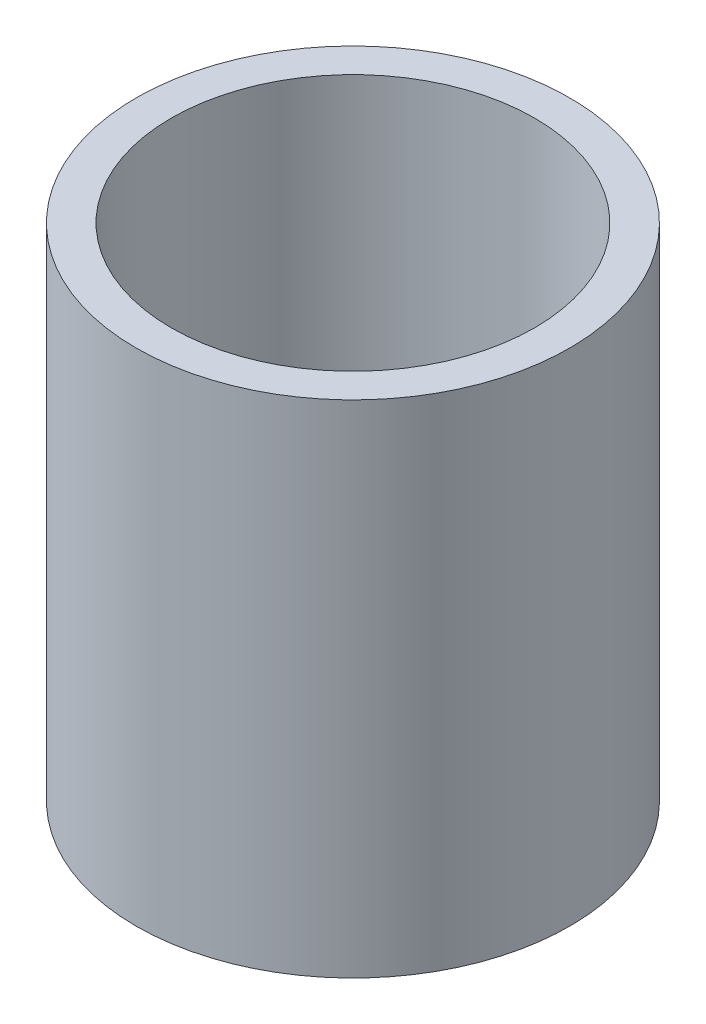
ISO-10303-21;
HEADER;
FILE_DESCRIPTION(('STEP AP214'),'2;1');
FILE_NAME('part.step','',(''),(''),'','','');
FILE_SCHEMA(('AUTOMOTIVE_DESIGN { 1 0 10303 214 1 1 1 1 }'));
ENDSEC;
DATA;
#1=APPLICATION_CONTEXT('core data for automotive mechanical design processes');
#2=APPLICATION_PROTOCOL_DEFINITION('international standard','automotive_design',2000,#1);
#3=PRODUCT_CONTEXT('',#1,'mechanical');
#4=PRODUCT('Part','Part','',(#3));
#5=PRODUCT_RELATED_PRODUCT_CATEGORY('part','',(#4));
#6=PRODUCT_DEFINITION_FORMATION('','',#4);
#7=PRODUCT_DEFINITION_CONTEXT('part definition',#1,'design');
#8=PRODUCT_DEFINITION('design','',#6,#7);
#9=PRODUCT_DEFINITION_SHAPE('','',#8);
#10=(LENGTH_UNIT() NAMED_UNIT(*) SI_UNIT(.MILLI.,.METRE.));
#11=(NAMED_UNIT(*) PLANE_ANGLE_UNIT() SI_UNIT($,.RADIAN.));
#12=(NAMED_UNIT(*) SI_UNIT($,.STERADIAN.) SOLID_ANGLE_UNIT());
#13=UNCERTAINTY_MEASURE_WITH_UNIT(LENGTH_MEASURE(1.E-05),#10,'distance_accuracy_value','');
#14=(GEOMETRIC_REPRESENTATION_CONTEXT(3) GLOBAL_UNCERTAINTY_ASSIGNED_CONTEXT((#13)) GLOBAL_UNIT_ASSIGNED_CONTEXT((#10,
#11,#12)) REPRESENTATION_CONTEXT('',''));
#15=CARTESIAN_POINT('',(0.,0.,0.));
#16=DIRECTION('',(0.,0.,1.));
#17=DIRECTION('',(1.,0.,0.));
#18=AXIS2_PLACEMENT_3D('',#15,#16,#17);
#19=CARTESIAN_POINT('',(0.,70.,0.));
#20=DIRECTION('',(0.,1.,0.));
#21=DIRECTION('',(0.,0.,1.));
#22=AXIS2_PLACEMENT_3D('',#19,#20,#21);
#23=PLANE('',#22);
#24=CARTESIAN_POINT('',(0.,70.,0.));
#25=DIRECTION('',(0.,1.,0.));
#26=DIRECTION('',(0.,0.,1.));
#27=AXIS2_PLACEMENT_3D('',#24,#25,#26);
#28=CIRCLE('',#27,30.3);
#29=CARTESIAN_POINT('',(0.,70.,30.3));
#30=VERTEX_POINT('',#29);
#31=EDGE_CURVE('E10',#30,#30,#28,.T.);
#32=ORIENTED_EDGE('',*,*,#31,.T.);
#33=EDGE_LOOP('',(#32));
#34=FACE_BOUND('',#33,.T.);
#35=CARTESIAN_POINT('',(0.,70.,0.));
#36=DIRECTION('',(0.,1.,0.));
#37=DIRECTION('',(0.,0.,1.));
#38=AXIS2_PLACEMENT_3D('',#35,#36,#37);
#39=CIRCLE('',#38,25.4);
#40=CARTESIAN_POINT('',(0.,70.,25.4));
#41=VERTEX_POINT('',#40);
#42=EDGE_CURVE('E54',#41,#41,#39,.T.);
#43=ORIENTED_EDGE('',*,*,#42,.F.);
#44=EDGE_LOOP('',(#43));
#45=FACE_BOUND('',#44,.T.);
#46=ADVANCED_FACE('F41',(#34,#45),#23,.T.);
#47=CARTESIAN_POINT('',(0.,0.,0.));
#48=DIRECTION('',(0.,1.,0.));
#49=DIRECTION('',(0.,0.,1.));
#50=AXIS2_PLACEMENT_3D('',#47,#48,#49);
#51=PLANE('',#50);
#52=CARTESIAN_POINT('',(0.,0.,0.));
#53=DIRECTION('',(0.,1.,0.));
#54=DIRECTION('',(0.,0.,1.));
#55=AXIS2_PLACEMENT_3D('',#52,#53,#54);
#56=CIRCLE('',#55,30.3);
#57=CARTESIAN_POINT('',(0.,0.,30.3));
#58=VERTEX_POINT('',#57);
#59=EDGE_CURVE('E45',#58,#58,#56,.T.);
#60=ORIENTED_EDGE('',*,*,#59,.F.);
#61=EDGE_LOOP('',(#60));
#62=FACE_BOUND('',#61,.T.);
#63=CARTESIAN_POINT('',(0.,0.,0.));
#64=DIRECTION('',(0.,1.,0.));
#65=DIRECTION('',(0.,0.,1.));
#66=AXIS2_PLACEMENT_3D('',#63,#64,#65);
#67=CIRCLE('',#66,25.4);
#68=CARTESIAN_POINT('',(0.,0.,25.4));
#69=VERTEX_POINT('',#68);
#70=EDGE_CURVE('E56',#69,#69,#67,.T.);
#71=ORIENTED_EDGE('',*,*,#70,.T.);
#72=EDGE_LOOP('',(#71));
#73=FACE_BOUND('',#72,.T.);
#74=ADVANCED_FACE('F68',(#62,#73),#51,.F.);
#75=CARTESIAN_POINT('',(0.,70.,0.));
#76=DIRECTION('',(0.,-1.,0.));
#77=DIRECTION('',(0.,0.,-1.));
#78=AXIS2_PLACEMENT_3D('',#75,#76,#77);
#79=CYLINDRICAL_SURFACE('',#78,30.3);
#80=ORIENTED_EDGE('',*,*,#31,.F.);
#81=EDGE_LOOP('',(#80));
#82=FACE_BOUND('',#81,.T.);
#83=ORIENTED_EDGE('',*,*,#59,.T.);
#84=EDGE_LOOP('',(#83));
#85=FACE_BOUND('',#84,.T.);
#86=ADVANCED_FACE('F43',(#82,#85),#79,.T.);
#87=CARTESIAN_POINT('',(0.,70.,0.));
#88=DIRECTION('',(0.,-1.,0.));
#89=DIRECTION('',(0.,0.,-1.));
#90=AXIS2_PLACEMENT_3D('',#87,#88,#89);
#91=CYLINDRICAL_SURFACE('',#90,25.4);
#92=ORIENTED_EDGE('',*,*,#42,.T.);
#93=EDGE_LOOP('',(#92));
#94=FACE_BOUND('',#93,.T.);
#95=ORIENTED_EDGE('',*,*,#70,.F.);
#96=EDGE_LOOP('',(#95));
#97=FACE_BOUND('',#96,.T.);
#98=ADVANCED_FACE('F64',(#94,#97),#91,.F.);
#99=CLOSED_SHELL('',(#46,#74,#86,#98));
#100=MANIFOLD_SOLID_BREP('B2',#99);
#101=ADVANCED_BREP_SHAPE_REPRESENTATION('',(#18,#100),#14);
#102=SHAPE_DEFINITION_REPRESENTATION(#9,#101);
ENDSEC;
END-ISO-10303-21;
